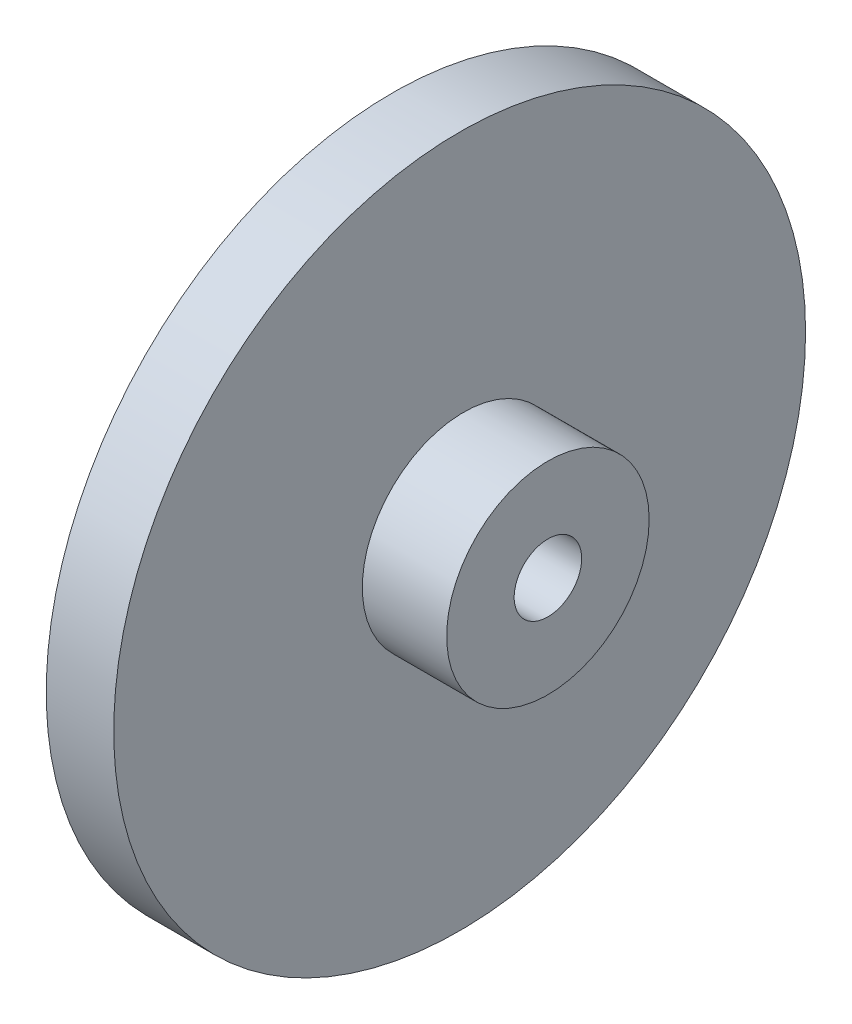
ISO-10303-21;
HEADER;
FILE_DESCRIPTION(('STEP AP214'),'2;1');
FILE_NAME('part.step','',(''),(''),'','','');
FILE_SCHEMA(('AUTOMOTIVE_DESIGN { 1 0 10303 214 1 1 1 1 }'));
ENDSEC;
DATA;
#1=APPLICATION_CONTEXT('core data for automotive mechanical design processes');
#2=APPLICATION_PROTOCOL_DEFINITION('international standard','automotive_design',2000,#1);
#3=PRODUCT_CONTEXT('',#1,'mechanical');
#4=PRODUCT('Part','Part','',(#3));
#5=PRODUCT_RELATED_PRODUCT_CATEGORY('part','',(#4));
#6=PRODUCT_DEFINITION_FORMATION('','',#4);
#7=PRODUCT_DEFINITION_CONTEXT('part definition',#1,'design');
#8=PRODUCT_DEFINITION('design','',#6,#7);
#9=PRODUCT_DEFINITION_SHAPE('','',#8);
#10=(LENGTH_UNIT() NAMED_UNIT(*) SI_UNIT(.MILLI.,.METRE.));
#11=(NAMED_UNIT(*) PLANE_ANGLE_UNIT() SI_UNIT($,.RADIAN.));
#12=(NAMED_UNIT(*) SI_UNIT($,.STERADIAN.) SOLID_ANGLE_UNIT());
#13=UNCERTAINTY_MEASURE_WITH_UNIT(LENGTH_MEASURE(1.E-05),#10,'distance_accuracy_value','');
#14=(GEOMETRIC_REPRESENTATION_CONTEXT(3) GLOBAL_UNCERTAINTY_ASSIGNED_CONTEXT((#13)) GLOBAL_UNIT_ASSIGNED_CONTEXT((#10,
#11,#12)) REPRESENTATION_CONTEXT('',''));
#15=CARTESIAN_POINT('',(0.,0.,0.));
#16=DIRECTION('',(0.,0.,1.));
#17=DIRECTION('',(1.,0.,0.));
#18=AXIS2_PLACEMENT_3D('',#15,#16,#17);
#19=CARTESIAN_POINT('',(4.,-0.19719948959146,0.));
#20=DIRECTION('',(1.,0.,0.));
#21=DIRECTION('',(0.,0.,-1.));
#22=AXIS2_PLACEMENT_3D('',#19,#20,#21);
#23=PLANE('',#22);
#24=CARTESIAN_POINT('',(4.,-0.19719948959146,0.));
#25=DIRECTION('',(1.,0.,0.));
#26=DIRECTION('',(0.,0.,-1.));
#27=AXIS2_PLACEMENT_3D('',#24,#25,#26);
#28=CIRCLE('',#27,20.5);
#29=CARTESIAN_POINT('',(4.,-0.19719948959146,-20.5));
#30=VERTEX_POINT('',#29);
#31=EDGE_CURVE('E10',#30,#30,#28,.T.);
#32=ORIENTED_EDGE('',*,*,#31,.T.);
#33=EDGE_LOOP('',(#32));
#34=FACE_BOUND('',#33,.T.);
#35=CARTESIAN_POINT('',(4.,-0.19719948959146,-0.230786773613545));
#36=DIRECTION('',(1.,0.,0.));
#37=DIRECTION('',(0.,0.,-1.));
#38=AXIS2_PLACEMENT_3D('',#35,#36,#37);
#39=CIRCLE('',#38,6.);
#40=CARTESIAN_POINT('',(4.,-0.19719948959146,-6.23078677361355));
#41=VERTEX_POINT('',#40);
#42=EDGE_CURVE('E47',#41,#41,#39,.T.);
#43=ORIENTED_EDGE('',*,*,#42,.F.);
#44=EDGE_LOOP('',(#43));
#45=FACE_BOUND('',#44,.T.);
#46=ADVANCED_FACE('F31',(#34,#45),#23,.T.);
#47=CARTESIAN_POINT('',(0.,-0.19719948959146,0.));
#48=DIRECTION('',(1.,0.,0.));
#49=DIRECTION('',(0.,0.,-1.));
#50=AXIS2_PLACEMENT_3D('',#47,#48,#49);
#51=PLANE('',#50);
#52=CARTESIAN_POINT('',(0.,-0.19719948959146,0.));
#53=DIRECTION('',(1.,0.,0.));
#54=DIRECTION('',(0.,0.,-1.));
#55=AXIS2_PLACEMENT_3D('',#52,#53,#54);
#56=CIRCLE('',#55,20.5);
#57=CARTESIAN_POINT('',(0.,-0.19719948959146,-20.5));
#58=VERTEX_POINT('',#57);
#59=EDGE_CURVE('E35',#58,#58,#56,.T.);
#60=ORIENTED_EDGE('',*,*,#59,.F.);
#61=EDGE_LOOP('',(#60));
#62=FACE_BOUND('',#61,.T.);
#63=CARTESIAN_POINT('',(0.,-0.19719948959146,-0.230786773613545));
#64=DIRECTION('',(1.,0.,0.));
#65=DIRECTION('',(0.,0.,-1.));
#66=AXIS2_PLACEMENT_3D('',#63,#64,#65);
#67=CIRCLE('',#66,2.);
#68=CARTESIAN_POINT('',(0.,-0.19719948959146,-2.23078677361355));
#69=VERTEX_POINT('',#68);
#70=EDGE_CURVE('E42',#69,#69,#67,.T.);
#71=ORIENTED_EDGE('',*,*,#70,.T.);
#72=EDGE_LOOP('',(#71));
#73=FACE_BOUND('',#72,.T.);
#74=ADVANCED_FACE('F72',(#62,#73),#51,.F.);
#75=CARTESIAN_POINT('',(4.,-0.19719948959146,0.));
#76=DIRECTION('',(-1.,0.,0.));
#77=DIRECTION('',(0.,0.,1.));
#78=AXIS2_PLACEMENT_3D('',#75,#76,#77);
#79=CYLINDRICAL_SURFACE('',#78,20.5);
#80=ORIENTED_EDGE('',*,*,#31,.F.);
#81=EDGE_LOOP('',(#80));
#82=FACE_BOUND('',#81,.T.);
#83=ORIENTED_EDGE('',*,*,#59,.T.);
#84=EDGE_LOOP('',(#83));
#85=FACE_BOUND('',#84,.T.);
#86=ADVANCED_FACE('F33',(#82,#85),#79,.T.);
#87=CARTESIAN_POINT('',(4.,-0.19719948959146,-0.230786773613545));
#88=DIRECTION('',(-1.,0.,0.));
#89=DIRECTION('',(0.,0.,1.));
#90=AXIS2_PLACEMENT_3D('',#87,#88,#89);
#91=CYLINDRICAL_SURFACE('',#90,2.);
#92=ORIENTED_EDGE('',*,*,#70,.F.);
#93=EDGE_LOOP('',(#92));
#94=FACE_BOUND('',#93,.T.);
#95=CARTESIAN_POINT('',(9.,-0.19719948959146,-0.230786773613545));
#96=DIRECTION('',(1.,0.,0.));
#97=DIRECTION('',(0.,0.,-1.));
#98=AXIS2_PLACEMENT_3D('',#95,#96,#97);
#99=CIRCLE('',#98,2.);
#100=CARTESIAN_POINT('',(9.,-0.19719948959146,-2.23078677361355));
#101=VERTEX_POINT('',#100);
#102=EDGE_CURVE('E50',#101,#101,#99,.T.);
#103=ORIENTED_EDGE('',*,*,#102,.T.);
#104=EDGE_LOOP('',(#103));
#105=FACE_BOUND('',#104,.T.);
#106=ADVANCED_FACE('F56',(#94,#105),#91,.F.);
#107=CARTESIAN_POINT('',(9.,-0.19719948959146,-0.230786773613545));
#108=DIRECTION('',(1.,0.,0.));
#109=DIRECTION('',(0.,0.,-1.));
#110=AXIS2_PLACEMENT_3D('',#107,#108,#109);
#111=PLANE('',#110);
#112=CARTESIAN_POINT('',(9.,-0.19719948959146,-0.230786773613545));
#113=DIRECTION('',(1.,0.,0.));
#114=DIRECTION('',(0.,0.,-1.));
#115=AXIS2_PLACEMENT_3D('',#112,#113,#114);
#116=CIRCLE('',#115,6.);
#117=CARTESIAN_POINT('',(9.,-0.19719948959146,-6.23078677361355));
#118=VERTEX_POINT('',#117);
#119=EDGE_CURVE('E46',#118,#118,#116,.T.);
#120=ORIENTED_EDGE('',*,*,#119,.T.);
#121=EDGE_LOOP('',(#120));
#122=FACE_BOUND('',#121,.T.);
#123=ORIENTED_EDGE('',*,*,#102,.F.);
#124=EDGE_LOOP('',(#123));
#125=FACE_BOUND('',#124,.T.);
#126=ADVANCED_FACE('F58',(#122,#125),#111,.T.);
#127=CARTESIAN_POINT('',(9.,-0.19719948959146,-0.230786773613545));
#128=DIRECTION('',(-1.,0.,0.));
#129=DIRECTION('',(0.,0.,1.));
#130=AXIS2_PLACEMENT_3D('',#127,#128,#129);
#131=CYLINDRICAL_SURFACE('',#130,6.);
#132=ORIENTED_EDGE('',*,*,#119,.F.);
#133=EDGE_LOOP('',(#132));
#134=FACE_BOUND('',#133,.T.);
#135=ORIENTED_EDGE('',*,*,#42,.T.);
#136=EDGE_LOOP('',(#135));
#137=FACE_BOUND('',#136,.T.);
#138=ADVANCED_FACE('F60',(#134,#137),#131,.T.);
#139=CLOSED_SHELL('',(#46,#74,#86,#106,#126,#138));
#140=MANIFOLD_SOLID_BREP('B2',#139);
#141=ADVANCED_BREP_SHAPE_REPRESENTATION('',(#18,#140),#14);
#142=SHAPE_DEFINITION_REPRESENTATION(#9,#141);
ENDSEC;
END-ISO-10303-21;
